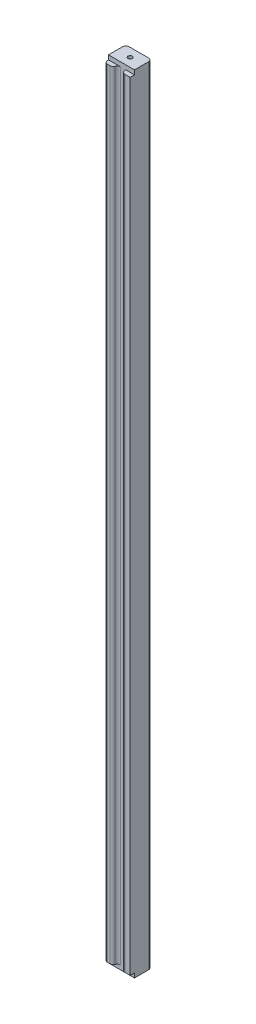
ISO-10303-21;
HEADER;
FILE_DESCRIPTION(('STEP AP214'),'2;1');
FILE_NAME('part.step','',(''),(''),'','','');
FILE_SCHEMA(('AUTOMOTIVE_DESIGN { 1 0 10303 214 1 1 1 1 }'));
ENDSEC;
DATA;
#1=APPLICATION_CONTEXT('core data for automotive mechanical design processes');
#2=APPLICATION_PROTOCOL_DEFINITION('international standard','automotive_design',2000,#1);
#3=PRODUCT_CONTEXT('',#1,'mechanical');
#4=PRODUCT('Part','Part','',(#3));
#5=PRODUCT_RELATED_PRODUCT_CATEGORY('part','',(#4));
#6=PRODUCT_DEFINITION_FORMATION('','',#4);
#7=PRODUCT_DEFINITION_CONTEXT('part definition',#1,'design');
#8=PRODUCT_DEFINITION('design','',#6,#7);
#9=PRODUCT_DEFINITION_SHAPE('','',#8);
#10=(LENGTH_UNIT() NAMED_UNIT(*) SI_UNIT(.MILLI.,.METRE.));
#11=(NAMED_UNIT(*) PLANE_ANGLE_UNIT() SI_UNIT($,.RADIAN.));
#12=(NAMED_UNIT(*) SI_UNIT($,.STERADIAN.) SOLID_ANGLE_UNIT());
#13=UNCERTAINTY_MEASURE_WITH_UNIT(LENGTH_MEASURE(1.E-05),#10,'distance_accuracy_value','');
#14=(GEOMETRIC_REPRESENTATION_CONTEXT(3) GLOBAL_UNCERTAINTY_ASSIGNED_CONTEXT((#13)) GLOBAL_UNIT_ASSIGNED_CONTEXT((#10,
#11,#12)) REPRESENTATION_CONTEXT('',''));
#15=CARTESIAN_POINT('',(0.,0.,0.));
#16=DIRECTION('',(0.,0.,1.));
#17=DIRECTION('',(1.,0.,0.));
#18=AXIS2_PLACEMENT_3D('',#15,#16,#17);
#19=CARTESIAN_POINT('',(0.,0.,25.));
#20=DIRECTION('',(0.,0.,-1.));
#21=DIRECTION('',(0.,-1.,0.));
#22=AXIS2_PLACEMENT_3D('',#19,#20,#21);
#23=PLANE('',#22);
#24=DIRECTION('',(0.,1.,0.));
#25=VECTOR('',#24,1.);
#26=CARTESIAN_POINT('',(-6.,0.,25.));
#27=LINE('',#26,#25);
#28=CARTESIAN_POINT('',(-6.,-448.5,25.));
#29=VERTEX_POINT('',#28);
#30=CARTESIAN_POINT('',(-6.,448.5,25.));
#31=VERTEX_POINT('',#30);
#32=EDGE_CURVE('E222',#29,#31,#27,.T.);
#33=ORIENTED_EDGE('',*,*,#32,.F.);
#34=DIRECTION('',(-1.,0.,0.));
#35=VECTOR('',#34,1.);
#36=CARTESIAN_POINT('',(0.,-448.5,25.));
#37=LINE('',#36,#35);
#38=CARTESIAN_POINT('',(0.,-448.5,25.));
#39=VERTEX_POINT('',#38);
#40=EDGE_CURVE('E249',#39,#29,#37,.T.);
#41=ORIENTED_EDGE('',*,*,#40,.F.);
#42=DIRECTION('',(0.,-1.,0.));
#43=VECTOR('',#42,1.);
#44=CARTESIAN_POINT('',(0.,0.,25.));
#45=LINE('',#44,#43);
#46=CARTESIAN_POINT('',(0.,448.5,25.));
#47=VERTEX_POINT('',#46);
#48=EDGE_CURVE('E305',#47,#39,#45,.T.);
#49=ORIENTED_EDGE('',*,*,#48,.F.);
#50=DIRECTION('',(-1.,0.,0.));
#51=VECTOR('',#50,1.);
#52=CARTESIAN_POINT('',(0.,448.5,25.));
#53=LINE('',#52,#51);
#54=EDGE_CURVE('E188',#47,#31,#53,.T.);
#55=ORIENTED_EDGE('',*,*,#54,.T.);
#56=EDGE_LOOP('',(#33,#41,#49,#55));
#57=FACE_BOUND('',#56,.T.);
#58=ADVANCED_FACE('F17',(#57),#23,.F.);
#59=CARTESIAN_POINT('',(-30.,0.,0.));
#60=DIRECTION('',(0.,0.,1.));
#61=DIRECTION('',(1.,0.,0.));
#62=AXIS2_PLACEMENT_3D('',#59,#60,#61);
#63=PLANE('',#62);
#64=DIRECTION('',(0.,-1.,0.));
#65=VECTOR('',#64,1.);
#66=CARTESIAN_POINT('',(-26.,0.,0.));
#67=LINE('',#66,#65);
#68=CARTESIAN_POINT('',(-26.,453.5,0.));
#69=VERTEX_POINT('',#68);
#70=CARTESIAN_POINT('',(-26.,-453.5,0.));
#71=VERTEX_POINT('',#70);
#72=EDGE_CURVE('E406',#69,#71,#67,.T.);
#73=ORIENTED_EDGE('',*,*,#72,.F.);
#74=DIRECTION('',(1.,0.,0.));
#75=VECTOR('',#74,1.);
#76=CARTESIAN_POINT('',(-30.,453.5,0.));
#77=LINE('',#76,#75);
#78=CARTESIAN_POINT('',(-4.,453.5,0.));
#79=VERTEX_POINT('',#78);
#80=EDGE_CURVE('E151',#69,#79,#77,.T.);
#81=ORIENTED_EDGE('',*,*,#80,.T.);
#82=DIRECTION('',(0.,1.,0.));
#83=VECTOR('',#82,1.);
#84=CARTESIAN_POINT('',(-4.,0.,0.));
#85=LINE('',#84,#83);
#86=CARTESIAN_POINT('',(-4.,-453.5,0.));
#87=VERTEX_POINT('',#86);
#88=EDGE_CURVE('E309',#87,#79,#85,.T.);
#89=ORIENTED_EDGE('',*,*,#88,.F.);
#90=DIRECTION('',(1.,0.,0.));
#91=VECTOR('',#90,1.);
#92=CARTESIAN_POINT('',(-30.,-453.5,0.));
#93=LINE('',#92,#91);
#94=EDGE_CURVE('E161',#71,#87,#93,.T.);
#95=ORIENTED_EDGE('',*,*,#94,.F.);
#96=EDGE_LOOP('',(#73,#81,#89,#95));
#97=FACE_BOUND('',#96,.T.);
#98=ADVANCED_FACE('F482',(#97),#63,.F.);
#99=CARTESIAN_POINT('',(-15.,423.5,10.));
#100=DIRECTION('',(0.,-1.,0.));
#101=DIRECTION('',(0.,0.,-1.));
#102=AXIS2_PLACEMENT_3D('',#99,#100,#101);
#103=PLANE('',#102);
#104=CARTESIAN_POINT('',(-15.,423.5,10.));
#105=DIRECTION('',(0.,1.,0.));
#106=DIRECTION('',(1.,0.,0.));
#107=AXIS2_PLACEMENT_3D('',#104,#105,#106);
#108=CIRCLE('',#107,2.5);
#109=CARTESIAN_POINT('',(-17.5,423.5,10.));
#110=VERTEX_POINT('',#109);
#111=EDGE_CURVE('E11',#110,#110,#108,.T.);
#112=ORIENTED_EDGE('',*,*,#111,.T.);
#113=EDGE_LOOP('',(#112));
#114=FACE_BOUND('',#113,.T.);
#115=ADVANCED_FACE('F488',(#114),#103,.F.);
#116=CARTESIAN_POINT('',(-15.,453.5,10.));
#117=DIRECTION('',(0.,1.,0.));
#118=DIRECTION('',(1.,0.,0.));
#119=AXIS2_PLACEMENT_3D('',#116,#117,#118);
#120=CYLINDRICAL_SURFACE('',#119,2.5);
#121=CARTESIAN_POINT('',(-15.,453.5,10.));
#122=DIRECTION('',(0.,1.,0.));
#123=DIRECTION('',(1.,0.,0.));
#124=AXIS2_PLACEMENT_3D('',#121,#122,#123);
#125=CIRCLE('',#124,2.5);
#126=CARTESIAN_POINT('',(-17.5,453.5,10.));
#127=VERTEX_POINT('',#126);
#128=EDGE_CURVE('E283',#127,#127,#125,.T.);
#129=ORIENTED_EDGE('',*,*,#128,.T.);
#130=DIRECTION('',(0.,-1.,0.));
#131=VECTOR('',#130,1.);
#132=CARTESIAN_POINT('',(-17.5,453.5,10.));
#133=LINE('',#132,#131);
#134=EDGE_CURVE('E28',#127,#110,#133,.T.);
#135=ORIENTED_EDGE('',*,*,#134,.T.);
#136=ORIENTED_EDGE('',*,*,#111,.F.);
#137=ORIENTED_EDGE('',*,*,#134,.F.);
#138=EDGE_LOOP('',(#129,#135,#136,#137));
#139=FACE_BOUND('',#138,.T.);
#140=ADVANCED_FACE('F495',(#139),#120,.F.);
#141=CARTESIAN_POINT('',(-15.,-448.5,12.5));
#142=DIRECTION('',(0.,-1.,0.));
#143=DIRECTION('',(0.,0.,-1.));
#144=AXIS2_PLACEMENT_3D('',#141,#142,#143);
#145=PLANE('',#144);
#146=CARTESIAN_POINT('',(-6.,-448.5,21.));
#147=DIRECTION('',(0.,1.,0.));
#148=DIRECTION('',(-0.707106781186548,0.,0.707106781186547));
#149=AXIS2_PLACEMENT_3D('',#146,#147,#148);
#150=CIRCLE('',#149,4.);
#151=CARTESIAN_POINT('',(-10.,-448.5,21.));
#152=VERTEX_POINT('',#151);
#153=EDGE_CURVE('E266',#152,#29,#150,.T.);
#154=ORIENTED_EDGE('',*,*,#153,.F.);
#155=DIRECTION('',(0.,0.,-1.));
#156=VECTOR('',#155,1.);
#157=CARTESIAN_POINT('',(-10.,-448.5,25.));
#158=LINE('',#157,#156);
#159=CARTESIAN_POINT('',(-10.,-448.5,20.));
#160=VERTEX_POINT('',#159);
#161=EDGE_CURVE('E210',#152,#160,#158,.T.);
#162=ORIENTED_EDGE('',*,*,#161,.T.);
#163=DIRECTION('',(1.,0.,0.));
#164=VECTOR('',#163,1.);
#165=CARTESIAN_POINT('',(-7.5,-448.5,20.));
#166=LINE('',#165,#164);
#167=CARTESIAN_POINT('',(0.,-448.5,20.));
#168=VERTEX_POINT('',#167);
#169=EDGE_CURVE('E235',#160,#168,#166,.T.);
#170=ORIENTED_EDGE('',*,*,#169,.T.);
#171=DIRECTION('',(0.,0.,1.));
#172=VECTOR('',#171,1.);
#173=CARTESIAN_POINT('',(0.,-448.5,0.));
#174=LINE('',#173,#172);
#175=EDGE_CURVE('E308',#168,#39,#174,.T.);
#176=ORIENTED_EDGE('',*,*,#175,.T.);
#177=ORIENTED_EDGE('',*,*,#40,.T.);
#178=EDGE_LOOP('',(#154,#162,#170,#176,#177));
#179=FACE_BOUND('',#178,.T.);
#180=ADVANCED_FACE('F508',(#179),#145,.T.);
#181=CARTESIAN_POINT('',(-15.,-448.5,12.5));
#182=DIRECTION('',(0.,-1.,0.));
#183=DIRECTION('',(0.,0.,-1.));
#184=AXIS2_PLACEMENT_3D('',#181,#182,#183);
#185=PLANE('',#184);
#186=CARTESIAN_POINT('',(-23.4161984870957,-448.5,21.));
#187=DIRECTION('',(0.,1.,0.));
#188=DIRECTION('',(0.,0.,-1.));
#189=AXIS2_PLACEMENT_3D('',#186,#187,#188);
#190=CIRCLE('',#189,4.);
#191=CARTESIAN_POINT('',(-23.4161984870957,-448.5,25.));
#192=VERTEX_POINT('',#191);
#193=CARTESIAN_POINT('',(-19.7080992435478,-448.5,22.5));
#194=VERTEX_POINT('',#193);
#195=EDGE_CURVE('E301',#192,#194,#190,.T.);
#196=ORIENTED_EDGE('',*,*,#195,.F.);
#197=DIRECTION('',(-1.,0.,0.));
#198=VECTOR('',#197,1.);
#199=CARTESIAN_POINT('',(-20.,-448.5,25.));
#200=LINE('',#199,#198);
#201=CARTESIAN_POINT('',(-26.,-448.5,25.));
#202=VERTEX_POINT('',#201);
#203=EDGE_CURVE('E324',#192,#202,#200,.T.);
#204=ORIENTED_EDGE('',*,*,#203,.T.);
#205=CARTESIAN_POINT('',(-26.,-448.5,21.));
#206=DIRECTION('',(0.,1.,0.));
#207=DIRECTION('',(-0.707106781186548,0.,0.707106781186547));
#208=AXIS2_PLACEMENT_3D('',#205,#206,#207);
#209=CIRCLE('',#208,4.);
#210=CARTESIAN_POINT('',(-30.,-448.5,21.));
#211=VERTEX_POINT('',#210);
#212=EDGE_CURVE('E334',#211,#202,#209,.T.);
#213=ORIENTED_EDGE('',*,*,#212,.F.);
#214=DIRECTION('',(0.,0.,-1.));
#215=VECTOR('',#214,1.);
#216=CARTESIAN_POINT('',(-30.,-448.5,25.));
#217=LINE('',#216,#215);
#218=CARTESIAN_POINT('',(-30.,-448.5,20.));
#219=VERTEX_POINT('',#218);
#220=EDGE_CURVE('E272',#211,#219,#217,.T.);
#221=ORIENTED_EDGE('',*,*,#220,.T.);
#222=DIRECTION('',(1.,0.,0.));
#223=VECTOR('',#222,1.);
#224=CARTESIAN_POINT('',(-7.5,-448.5,20.));
#225=LINE('',#224,#223);
#226=CARTESIAN_POINT('',(-16.,-448.5,20.));
#227=VERTEX_POINT('',#226);
#228=EDGE_CURVE('E329',#219,#227,#225,.T.);
#229=ORIENTED_EDGE('',*,*,#228,.T.);
#230=CARTESIAN_POINT('',(-16.,-448.5,24.));
#231=DIRECTION('',(0.,-1.,0.));
#232=DIRECTION('',(-0.707106781186548,0.,-0.707106781186547));
#233=AXIS2_PLACEMENT_3D('',#230,#231,#232);
#234=CIRCLE('',#233,4.);
#235=EDGE_CURVE('E328',#194,#227,#234,.T.);
#236=ORIENTED_EDGE('',*,*,#235,.F.);
#237=EDGE_LOOP('',(#196,#204,#213,#221,#229,#236));
#238=FACE_BOUND('',#237,.T.);
#239=ADVANCED_FACE('F322',(#238),#185,.T.);
#240=CARTESIAN_POINT('',(-15.,-453.5,10.));
#241=DIRECTION('',(0.,-1.,0.));
#242=DIRECTION('',(0.,0.,-1.));
#243=AXIS2_PLACEMENT_3D('',#240,#241,#242);
#244=PLANE('',#243);
#245=CARTESIAN_POINT('',(-15.,-453.5,10.));
#246=DIRECTION('',(0.,1.,0.));
#247=DIRECTION('',(1.,0.,0.));
#248=AXIS2_PLACEMENT_3D('',#245,#246,#247);
#249=CIRCLE('',#248,2.5);
#250=CARTESIAN_POINT('',(-17.5,-453.5,10.));
#251=VERTEX_POINT('',#250);
#252=EDGE_CURVE('E408',#251,#251,#249,.T.);
#253=ORIENTED_EDGE('',*,*,#252,.T.);
#254=EDGE_LOOP('',(#253));
#255=FACE_BOUND('',#254,.T.);
#256=CARTESIAN_POINT('',(-26.,-453.5,4.));
#257=DIRECTION('',(0.,1.,0.));
#258=DIRECTION('',(-0.707106781186547,0.,-0.707106781186548));
#259=AXIS2_PLACEMENT_3D('',#256,#257,#258);
#260=CIRCLE('',#259,4.);
#261=CARTESIAN_POINT('',(-30.,-453.5,4.));
#262=VERTEX_POINT('',#261);
#263=EDGE_CURVE('E378',#71,#262,#260,.T.);
#264=ORIENTED_EDGE('',*,*,#263,.F.);
#265=ORIENTED_EDGE('',*,*,#94,.T.);
#266=CARTESIAN_POINT('',(-4.,-453.5,4.));
#267=DIRECTION('',(0.,1.,0.));
#268=DIRECTION('',(0.707106781186547,0.,-0.707106781186548));
#269=AXIS2_PLACEMENT_3D('',#266,#267,#268);
#270=CIRCLE('',#269,4.);
#271=CARTESIAN_POINT('',(0.,-453.5,4.));
#272=VERTEX_POINT('',#271);
#273=EDGE_CURVE('E400',#272,#87,#270,.T.);
#274=ORIENTED_EDGE('',*,*,#273,.F.);
#275=DIRECTION('',(0.,0.,1.));
#276=VECTOR('',#275,1.);
#277=CARTESIAN_POINT('',(0.,-453.5,0.));
#278=LINE('',#277,#276);
#279=CARTESIAN_POINT('',(0.,-453.5,20.));
#280=VERTEX_POINT('',#279);
#281=EDGE_CURVE('E413',#272,#280,#278,.T.);
#282=ORIENTED_EDGE('',*,*,#281,.T.);
#283=DIRECTION('',(-1.,0.,0.));
#284=VECTOR('',#283,1.);
#285=CARTESIAN_POINT('',(0.,-453.5,20.));
#286=LINE('',#285,#284);
#287=CARTESIAN_POINT('',(-30.,-453.5,20.));
#288=VERTEX_POINT('',#287);
#289=EDGE_CURVE('E369',#280,#288,#286,.T.);
#290=ORIENTED_EDGE('',*,*,#289,.T.);
#291=DIRECTION('',(0.,0.,-1.));
#292=VECTOR('',#291,1.);
#293=CARTESIAN_POINT('',(-30.,-453.5,20.));
#294=LINE('',#293,#292);
#295=EDGE_CURVE('E273',#288,#262,#294,.T.);
#296=ORIENTED_EDGE('',*,*,#295,.T.);
#297=EDGE_LOOP('',(#264,#265,#274,#282,#290,#296));
#298=FACE_BOUND('',#297,.T.);
#299=ADVANCED_FACE('F442',(#255,#298),#244,.T.);
#300=CARTESIAN_POINT('',(-15.,-423.5,10.));
#301=DIRECTION('',(0.,-1.,0.));
#302=DIRECTION('',(0.,0.,-1.));
#303=AXIS2_PLACEMENT_3D('',#300,#301,#302);
#304=PLANE('',#303);
#305=CARTESIAN_POINT('',(-15.,-423.5,10.));
#306=DIRECTION('',(0.,1.,0.));
#307=DIRECTION('',(1.,0.,0.));
#308=AXIS2_PLACEMENT_3D('',#305,#306,#307);
#309=CIRCLE('',#308,2.5);
#310=CARTESIAN_POINT('',(-17.5,-423.5,10.));
#311=VERTEX_POINT('',#310);
#312=EDGE_CURVE('E250',#311,#311,#309,.T.);
#313=ORIENTED_EDGE('',*,*,#312,.F.);
#314=EDGE_LOOP('',(#313));
#315=FACE_BOUND('',#314,.T.);
#316=ADVANCED_FACE('F468',(#315),#304,.T.);
#317=CARTESIAN_POINT('',(-15.,-453.5,10.));
#318=DIRECTION('',(0.,1.,0.));
#319=DIRECTION('',(1.,0.,0.));
#320=AXIS2_PLACEMENT_3D('',#317,#318,#319);
#321=CYLINDRICAL_SURFACE('',#320,2.5);
#322=ORIENTED_EDGE('',*,*,#252,.F.);
#323=DIRECTION('',(0.,1.,0.));
#324=VECTOR('',#323,1.);
#325=CARTESIAN_POINT('',(-17.5,-453.5,10.));
#326=LINE('',#325,#324);
#327=EDGE_CURVE('E412',#251,#311,#326,.T.);
#328=ORIENTED_EDGE('',*,*,#327,.T.);
#329=ORIENTED_EDGE('',*,*,#312,.T.);
#330=ORIENTED_EDGE('',*,*,#327,.F.);
#331=EDGE_LOOP('',(#322,#328,#329,#330));
#332=FACE_BOUND('',#331,.T.);
#333=ADVANCED_FACE('F466',(#332),#321,.F.);
#334=CARTESIAN_POINT('',(0.,0.,0.));
#335=DIRECTION('',(-1.,0.,0.));
#336=DIRECTION('',(0.,0.,1.));
#337=AXIS2_PLACEMENT_3D('',#334,#335,#336);
#338=PLANE('',#337);
#339=DIRECTION('',(0.,-1.,0.));
#340=VECTOR('',#339,1.);
#341=CARTESIAN_POINT('',(0.,0.,4.));
#342=LINE('',#341,#340);
#343=CARTESIAN_POINT('',(0.,453.5,4.));
#344=VERTEX_POINT('',#343);
#345=EDGE_CURVE('E304',#344,#272,#342,.T.);
#346=ORIENTED_EDGE('',*,*,#345,.F.);
#347=DIRECTION('',(0.,0.,1.));
#348=VECTOR('',#347,1.);
#349=CARTESIAN_POINT('',(0.,453.5,0.));
#350=LINE('',#349,#348);
#351=CARTESIAN_POINT('',(0.,453.5,20.));
#352=VERTEX_POINT('',#351);
#353=EDGE_CURVE('E364',#344,#352,#350,.T.);
#354=ORIENTED_EDGE('',*,*,#353,.T.);
#355=DIRECTION('',(0.,1.,0.));
#356=VECTOR('',#355,1.);
#357=CARTESIAN_POINT('',(0.,448.5,20.));
#358=LINE('',#357,#356);
#359=CARTESIAN_POINT('',(0.,448.5,20.));
#360=VERTEX_POINT('',#359);
#361=EDGE_CURVE('E231',#360,#352,#358,.T.);
#362=ORIENTED_EDGE('',*,*,#361,.F.);
#363=DIRECTION('',(0.,0.,1.));
#364=VECTOR('',#363,1.);
#365=CARTESIAN_POINT('',(0.,448.5,0.));
#366=LINE('',#365,#364);
#367=EDGE_CURVE('E228',#360,#47,#366,.T.);
#368=ORIENTED_EDGE('',*,*,#367,.T.);
#369=ORIENTED_EDGE('',*,*,#48,.T.);
#370=ORIENTED_EDGE('',*,*,#175,.F.);
#371=DIRECTION('',(0.,-1.,0.));
#372=VECTOR('',#371,1.);
#373=CARTESIAN_POINT('',(0.,-448.5,20.));
#374=LINE('',#373,#372);
#375=EDGE_CURVE('E242',#168,#280,#374,.T.);
#376=ORIENTED_EDGE('',*,*,#375,.T.);
#377=ORIENTED_EDGE('',*,*,#281,.F.);
#378=EDGE_LOOP('',(#346,#354,#362,#368,#369,#370,#376,#377));
#379=FACE_BOUND('',#378,.T.);
#380=ADVANCED_FACE('F437',(#379),#338,.F.);
#381=CARTESIAN_POINT('',(-4.,0.,4.));
#382=DIRECTION('',(0.,1.,0.));
#383=DIRECTION('',(0.707106781186547,0.,-0.707106781186548));
#384=AXIS2_PLACEMENT_3D('',#381,#382,#383);
#385=CYLINDRICAL_SURFACE('',#384,4.);
#386=CARTESIAN_POINT('',(-4.,453.5,4.));
#387=DIRECTION('',(0.,-1.,0.));
#388=DIRECTION('',(0.707106781186547,0.,-0.707106781186548));
#389=AXIS2_PLACEMENT_3D('',#386,#387,#388);
#390=CIRCLE('',#389,4.);
#391=EDGE_CURVE('E383',#79,#344,#390,.T.);
#392=ORIENTED_EDGE('',*,*,#391,.T.);
#393=ORIENTED_EDGE('',*,*,#345,.T.);
#394=ORIENTED_EDGE('',*,*,#273,.T.);
#395=ORIENTED_EDGE('',*,*,#88,.T.);
#396=EDGE_LOOP('',(#392,#393,#394,#395));
#397=FACE_BOUND('',#396,.T.);
#398=ADVANCED_FACE('F428',(#397),#385,.T.);
#399=CARTESIAN_POINT('',(-15.,448.5,12.5));
#400=DIRECTION('',(0.,-1.,0.));
#401=DIRECTION('',(0.,0.,-1.));
#402=AXIS2_PLACEMENT_3D('',#399,#400,#401);
#403=PLANE('',#402);
#404=CARTESIAN_POINT('',(-6.,448.5,21.));
#405=DIRECTION('',(0.,-1.,0.));
#406=DIRECTION('',(-0.707106781186548,0.,0.707106781186547));
#407=AXIS2_PLACEMENT_3D('',#404,#405,#406);
#408=CIRCLE('',#407,4.);
#409=CARTESIAN_POINT('',(-10.,448.5,21.));
#410=VERTEX_POINT('',#409);
#411=EDGE_CURVE('E392',#31,#410,#408,.T.);
#412=ORIENTED_EDGE('',*,*,#411,.F.);
#413=ORIENTED_EDGE('',*,*,#54,.F.);
#414=ORIENTED_EDGE('',*,*,#367,.F.);
#415=DIRECTION('',(1.,0.,0.));
#416=VECTOR('',#415,1.);
#417=CARTESIAN_POINT('',(-7.5,448.5,20.));
#418=LINE('',#417,#416);
#419=CARTESIAN_POINT('',(-10.,448.5,20.));
#420=VERTEX_POINT('',#419);
#421=EDGE_CURVE('E225',#420,#360,#418,.T.);
#422=ORIENTED_EDGE('',*,*,#421,.F.);
#423=DIRECTION('',(0.,0.,-1.));
#424=VECTOR('',#423,1.);
#425=CARTESIAN_POINT('',(-10.,448.5,25.));
#426=LINE('',#425,#424);
#427=EDGE_CURVE('E177',#410,#420,#426,.T.);
#428=ORIENTED_EDGE('',*,*,#427,.F.);
#429=EDGE_LOOP('',(#412,#413,#414,#422,#428));
#430=FACE_BOUND('',#429,.T.);
#431=ADVANCED_FACE('F226',(#430),#403,.F.);
#432=CARTESIAN_POINT('',(-10.,0.,25.));
#433=DIRECTION('',(1.,0.,0.));
#434=DIRECTION('',(0.,1.,0.));
#435=AXIS2_PLACEMENT_3D('',#432,#433,#434);
#436=PLANE('',#435);
#437=DIRECTION('',(0.,-1.,0.));
#438=VECTOR('',#437,1.);
#439=CARTESIAN_POINT('',(-10.,0.,21.));
#440=LINE('',#439,#438);
#441=EDGE_CURVE('E219',#410,#152,#440,.T.);
#442=ORIENTED_EDGE('',*,*,#441,.F.);
#443=ORIENTED_EDGE('',*,*,#427,.T.);
#444=DIRECTION('',(0.,1.,0.));
#445=VECTOR('',#444,1.);
#446=CARTESIAN_POINT('',(-10.,0.,20.));
#447=LINE('',#446,#445);
#448=EDGE_CURVE('E216',#160,#420,#447,.T.);
#449=ORIENTED_EDGE('',*,*,#448,.F.);
#450=ORIENTED_EDGE('',*,*,#161,.F.);
#451=EDGE_LOOP('',(#442,#443,#449,#450));
#452=FACE_BOUND('',#451,.T.);
#453=ADVANCED_FACE('F214',(#452),#436,.F.);
#454=CARTESIAN_POINT('',(-6.,0.,21.));
#455=DIRECTION('',(0.,1.,0.));
#456=DIRECTION('',(-0.707106781186548,0.,0.707106781186547));
#457=AXIS2_PLACEMENT_3D('',#454,#455,#456);
#458=CYLINDRICAL_SURFACE('',#457,4.);
#459=ORIENTED_EDGE('',*,*,#411,.T.);
#460=ORIENTED_EDGE('',*,*,#441,.T.);
#461=ORIENTED_EDGE('',*,*,#153,.T.);
#462=ORIENTED_EDGE('',*,*,#32,.T.);
#463=EDGE_LOOP('',(#459,#460,#461,#462));
#464=FACE_BOUND('',#463,.T.);
#465=ADVANCED_FACE('F496',(#464),#458,.T.);
#466=CARTESIAN_POINT('',(-10.,0.,20.));
#467=DIRECTION('',(0.,0.,-1.));
#468=DIRECTION('',(0.,-1.,0.));
#469=AXIS2_PLACEMENT_3D('',#466,#467,#468);
#470=PLANE('',#469);
#471=DIRECTION('',(1.,0.,0.));
#472=VECTOR('',#471,1.);
#473=CARTESIAN_POINT('',(-7.5,448.5,20.));
#474=LINE('',#473,#472);
#475=CARTESIAN_POINT('',(-30.,448.5,20.));
#476=VERTEX_POINT('',#475);
#477=CARTESIAN_POINT('',(-16.,448.5,20.));
#478=VERTEX_POINT('',#477);
#479=EDGE_CURVE('E251',#476,#478,#474,.T.);
#480=ORIENTED_EDGE('',*,*,#479,.T.);
#481=DIRECTION('',(0.,1.,0.));
#482=VECTOR('',#481,1.);
#483=CARTESIAN_POINT('',(-16.,0.,20.));
#484=LINE('',#483,#482);
#485=EDGE_CURVE('E333',#227,#478,#484,.T.);
#486=ORIENTED_EDGE('',*,*,#485,.F.);
#487=ORIENTED_EDGE('',*,*,#228,.F.);
#488=DIRECTION('',(0.,-1.,0.));
#489=VECTOR('',#488,1.);
#490=CARTESIAN_POINT('',(-30.,-448.5,20.));
#491=LINE('',#490,#489);
#492=EDGE_CURVE('E269',#219,#288,#491,.T.);
#493=ORIENTED_EDGE('',*,*,#492,.T.);
#494=ORIENTED_EDGE('',*,*,#289,.F.);
#495=ORIENTED_EDGE('',*,*,#375,.F.);
#496=ORIENTED_EDGE('',*,*,#169,.F.);
#497=ORIENTED_EDGE('',*,*,#448,.T.);
#498=ORIENTED_EDGE('',*,*,#421,.T.);
#499=ORIENTED_EDGE('',*,*,#361,.T.);
#500=DIRECTION('',(-1.,0.,0.));
#501=VECTOR('',#500,1.);
#502=CARTESIAN_POINT('',(0.,453.5,20.));
#503=LINE('',#502,#501);
#504=CARTESIAN_POINT('',(-30.,453.5,20.));
#505=VERTEX_POINT('',#504);
#506=EDGE_CURVE('E361',#352,#505,#503,.T.);
#507=ORIENTED_EDGE('',*,*,#506,.T.);
#508=DIRECTION('',(0.,1.,0.));
#509=VECTOR('',#508,1.);
#510=CARTESIAN_POINT('',(-30.,448.5,20.));
#511=LINE('',#510,#509);
#512=EDGE_CURVE('E97',#476,#505,#511,.T.);
#513=ORIENTED_EDGE('',*,*,#512,.F.);
#514=EDGE_LOOP('',(#480,#486,#487,#493,#494,#495,#496,#497,#498,#499,#507,#513));
#515=FACE_BOUND('',#514,.T.);
#516=ADVANCED_FACE('F233',(#515),#470,.F.);
#517=CARTESIAN_POINT('',(-16.,0.,24.));
#518=DIRECTION('',(0.,1.,0.));
#519=DIRECTION('',(-0.707106781186548,0.,-0.707106781186547));
#520=AXIS2_PLACEMENT_3D('',#517,#518,#519);
#521=CYLINDRICAL_SURFACE('',#520,4.);
#522=DIRECTION('',(0.,1.,0.));
#523=VECTOR('',#522,1.);
#524=CARTESIAN_POINT('',(-19.7080992435478,0.,22.5));
#525=LINE('',#524,#523);
#526=CARTESIAN_POINT('',(-19.7080992435478,448.5,22.5));
#527=VERTEX_POINT('',#526);
#528=EDGE_CURVE('E297',#194,#527,#525,.T.);
#529=ORIENTED_EDGE('',*,*,#528,.F.);
#530=ORIENTED_EDGE('',*,*,#235,.T.);
#531=ORIENTED_EDGE('',*,*,#485,.T.);
#532=CARTESIAN_POINT('',(-16.,448.5,24.));
#533=DIRECTION('',(0.,1.,0.));
#534=DIRECTION('',(-0.707106781186548,0.,-0.707106781186547));
#535=AXIS2_PLACEMENT_3D('',#532,#533,#534);
#536=CIRCLE('',#535,4.);
#537=EDGE_CURVE('E255',#478,#527,#536,.T.);
#538=ORIENTED_EDGE('',*,*,#537,.T.);
#539=EDGE_LOOP('',(#529,#530,#531,#538));
#540=FACE_BOUND('',#539,.T.);
#541=ADVANCED_FACE('F336',(#540),#521,.F.);
#542=CARTESIAN_POINT('',(-26.,0.,21.));
#543=DIRECTION('',(0.,1.,0.));
#544=DIRECTION('',(-0.707106781186548,0.,0.707106781186547));
#545=AXIS2_PLACEMENT_3D('',#542,#543,#544);
#546=CYLINDRICAL_SURFACE('',#545,4.);
#547=CARTESIAN_POINT('',(-26.,448.5,21.));
#548=DIRECTION('',(0.,-1.,0.));
#549=DIRECTION('',(-0.707106781186548,0.,0.707106781186547));
#550=AXIS2_PLACEMENT_3D('',#547,#548,#549);
#551=CIRCLE('',#550,4.);
#552=CARTESIAN_POINT('',(-26.,448.5,25.));
#553=VERTEX_POINT('',#552);
#554=CARTESIAN_POINT('',(-30.,448.5,21.));
#555=VERTEX_POINT('',#554);
#556=EDGE_CURVE('E256',#553,#555,#551,.T.);
#557=ORIENTED_EDGE('',*,*,#556,.T.);
#558=DIRECTION('',(0.,-1.,0.));
#559=VECTOR('',#558,1.);
#560=CARTESIAN_POINT('',(-30.,0.,21.));
#561=LINE('',#560,#559);
#562=EDGE_CURVE('E21',#555,#211,#561,.T.);
#563=ORIENTED_EDGE('',*,*,#562,.T.);
#564=ORIENTED_EDGE('',*,*,#212,.T.);
#565=DIRECTION('',(0.,1.,0.));
#566=VECTOR('',#565,1.);
#567=CARTESIAN_POINT('',(-26.,0.,25.));
#568=LINE('',#567,#566);
#569=EDGE_CURVE('E349',#202,#553,#568,.T.);
#570=ORIENTED_EDGE('',*,*,#569,.T.);
#571=EDGE_LOOP('',(#557,#563,#564,#570));
#572=FACE_BOUND('',#571,.T.);
#573=ADVANCED_FACE('F516',(#572),#546,.T.);
#574=CARTESIAN_POINT('',(-30.,0.,25.));
#575=DIRECTION('',(1.,0.,0.));
#576=DIRECTION('',(0.,1.,0.));
#577=AXIS2_PLACEMENT_3D('',#574,#575,#576);
#578=PLANE('',#577);
#579=DIRECTION('',(0.,1.,0.));
#580=VECTOR('',#579,1.);
#581=CARTESIAN_POINT('',(-30.,0.,4.));
#582=LINE('',#581,#580);
#583=CARTESIAN_POINT('',(-30.,453.5,4.));
#584=VERTEX_POINT('',#583);
#585=EDGE_CURVE('E374',#262,#584,#582,.T.);
#586=ORIENTED_EDGE('',*,*,#585,.F.);
#587=ORIENTED_EDGE('',*,*,#295,.F.);
#588=ORIENTED_EDGE('',*,*,#492,.F.);
#589=ORIENTED_EDGE('',*,*,#220,.F.);
#590=ORIENTED_EDGE('',*,*,#562,.F.);
#591=DIRECTION('',(0.,0.,-1.));
#592=VECTOR('',#591,1.);
#593=CARTESIAN_POINT('',(-30.,448.5,25.));
#594=LINE('',#593,#592);
#595=EDGE_CURVE('E254',#555,#476,#594,.T.);
#596=ORIENTED_EDGE('',*,*,#595,.T.);
#597=ORIENTED_EDGE('',*,*,#512,.T.);
#598=DIRECTION('',(0.,0.,-1.));
#599=VECTOR('',#598,1.);
#600=CARTESIAN_POINT('',(-30.,453.5,20.));
#601=LINE('',#600,#599);
#602=EDGE_CURVE('E365',#505,#584,#601,.T.);
#603=ORIENTED_EDGE('',*,*,#602,.T.);
#604=EDGE_LOOP('',(#586,#587,#588,#589,#590,#596,#597,#603));
#605=FACE_BOUND('',#604,.T.);
#606=ADVANCED_FACE('F19',(#605),#578,.F.);
#607=CARTESIAN_POINT('',(-15.,453.5,10.));
#608=DIRECTION('',(0.,-1.,0.));
#609=DIRECTION('',(0.,0.,-1.));
#610=AXIS2_PLACEMENT_3D('',#607,#608,#609);
#611=PLANE('',#610);
#612=ORIENTED_EDGE('',*,*,#128,.F.);
#613=EDGE_LOOP('',(#612));
#614=FACE_BOUND('',#613,.T.);
#615=CARTESIAN_POINT('',(-26.,453.5,4.));
#616=DIRECTION('',(0.,-1.,0.));
#617=DIRECTION('',(-0.707106781186547,0.,-0.707106781186548));
#618=AXIS2_PLACEMENT_3D('',#615,#616,#617);
#619=CIRCLE('',#618,4.);
#620=EDGE_CURVE('E259',#584,#69,#619,.T.);
#621=ORIENTED_EDGE('',*,*,#620,.F.);
#622=ORIENTED_EDGE('',*,*,#602,.F.);
#623=ORIENTED_EDGE('',*,*,#506,.F.);
#624=ORIENTED_EDGE('',*,*,#353,.F.);
#625=ORIENTED_EDGE('',*,*,#391,.F.);
#626=ORIENTED_EDGE('',*,*,#80,.F.);
#627=EDGE_LOOP('',(#621,#622,#623,#624,#625,#626));
#628=FACE_BOUND('',#627,.T.);
#629=ADVANCED_FACE('F434',(#614,#628),#611,.F.);
#630=CARTESIAN_POINT('',(-26.,0.,4.));
#631=DIRECTION('',(0.,1.,0.));
#632=DIRECTION('',(-0.707106781186547,0.,-0.707106781186548));
#633=AXIS2_PLACEMENT_3D('',#630,#631,#632);
#634=CYLINDRICAL_SURFACE('',#633,4.);
#635=ORIENTED_EDGE('',*,*,#620,.T.);
#636=ORIENTED_EDGE('',*,*,#72,.T.);
#637=ORIENTED_EDGE('',*,*,#263,.T.);
#638=ORIENTED_EDGE('',*,*,#585,.T.);
#639=EDGE_LOOP('',(#635,#636,#637,#638));
#640=FACE_BOUND('',#639,.T.);
#641=ADVANCED_FACE('F519',(#640),#634,.T.);
#642=CARTESIAN_POINT('',(-15.,448.5,12.5));
#643=DIRECTION('',(0.,-1.,0.));
#644=DIRECTION('',(0.,0.,-1.));
#645=AXIS2_PLACEMENT_3D('',#642,#643,#644);
#646=PLANE('',#645);
#647=CARTESIAN_POINT('',(-23.4161984870957,448.5,21.));
#648=DIRECTION('',(0.,-1.,0.));
#649=DIRECTION('',(0.,0.,-1.));
#650=AXIS2_PLACEMENT_3D('',#647,#648,#649);
#651=CIRCLE('',#650,4.);
#652=CARTESIAN_POINT('',(-23.4161984870957,448.5,25.));
#653=VERTEX_POINT('',#652);
#654=EDGE_CURVE('E264',#527,#653,#651,.T.);
#655=ORIENTED_EDGE('',*,*,#654,.F.);
#656=ORIENTED_EDGE('',*,*,#537,.F.);
#657=ORIENTED_EDGE('',*,*,#479,.F.);
#658=ORIENTED_EDGE('',*,*,#595,.F.);
#659=ORIENTED_EDGE('',*,*,#556,.F.);
#660=DIRECTION('',(-1.,0.,0.));
#661=VECTOR('',#660,1.);
#662=CARTESIAN_POINT('',(-20.,448.5,25.));
#663=LINE('',#662,#661);
#664=EDGE_CURVE('E263',#653,#553,#663,.T.);
#665=ORIENTED_EDGE('',*,*,#664,.F.);
#666=EDGE_LOOP('',(#655,#656,#657,#658,#659,#665));
#667=FACE_BOUND('',#666,.T.);
#668=ADVANCED_FACE('F343',(#667),#646,.F.);
#669=CARTESIAN_POINT('',(-20.,0.,25.));
#670=DIRECTION('',(0.,0.,-1.));
#671=DIRECTION('',(0.,-1.,0.));
#672=AXIS2_PLACEMENT_3D('',#669,#670,#671);
#673=PLANE('',#672);
#674=DIRECTION('',(0.,-1.,0.));
#675=VECTOR('',#674,1.);
#676=CARTESIAN_POINT('',(-23.4161984870957,0.,25.));
#677=LINE('',#676,#675);
#678=EDGE_CURVE('E260',#653,#192,#677,.T.);
#679=ORIENTED_EDGE('',*,*,#678,.F.);
#680=ORIENTED_EDGE('',*,*,#664,.T.);
#681=ORIENTED_EDGE('',*,*,#569,.F.);
#682=ORIENTED_EDGE('',*,*,#203,.F.);
#683=EDGE_LOOP('',(#679,#680,#681,#682));
#684=FACE_BOUND('',#683,.T.);
#685=ADVANCED_FACE('F351',(#684),#673,.F.);
#686=CARTESIAN_POINT('',(-23.4161984870957,0.,21.));
#687=DIRECTION('',(0.,1.,0.));
#688=DIRECTION('',(0.,0.,-1.));
#689=AXIS2_PLACEMENT_3D('',#686,#687,#688);
#690=CYLINDRICAL_SURFACE('',#689,4.);
#691=ORIENTED_EDGE('',*,*,#195,.T.);
#692=ORIENTED_EDGE('',*,*,#528,.T.);
#693=ORIENTED_EDGE('',*,*,#654,.T.);
#694=ORIENTED_EDGE('',*,*,#678,.T.);
#695=EDGE_LOOP('',(#691,#692,#693,#694));
#696=FACE_BOUND('',#695,.T.);
#697=ADVANCED_FACE('F316',(#696),#690,.T.);
#698=CLOSED_SHELL('',(#58,#98,#115,#140,#180,#239,#299,#316,#333,#380,#398,#431,#453,#465,#516,
#541,#573,#606,#629,#641,#668,#685,#697));
#699=MANIFOLD_SOLID_BREP('B1',#698);
#700=ADVANCED_BREP_SHAPE_REPRESENTATION('',(#18,#699),#14);
#701=SHAPE_DEFINITION_REPRESENTATION(#9,#700);
ENDSEC;
END-ISO-10303-21;
